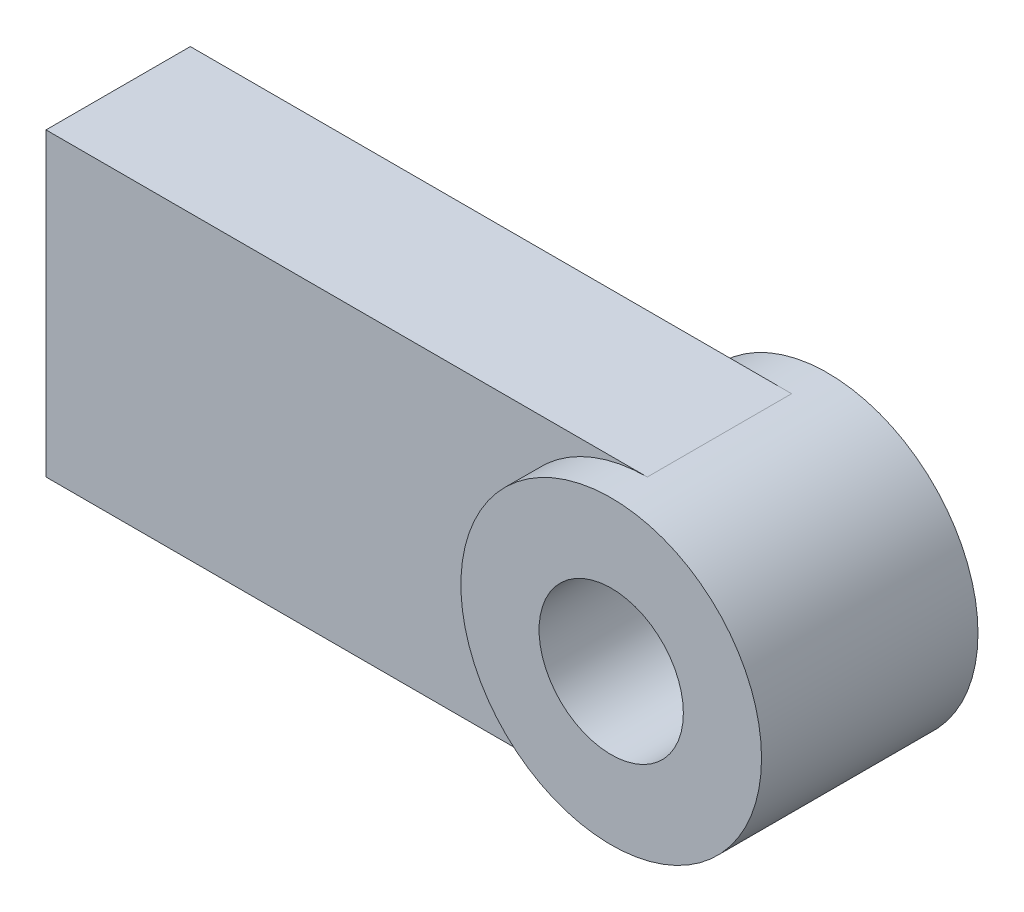
ISO-10303-21;
HEADER;
FILE_DESCRIPTION(('STEP AP214'),'2;1');
FILE_NAME('part.step','',(''),(''),'','','');
FILE_SCHEMA(('AUTOMOTIVE_DESIGN { 1 0 10303 214 1 1 1 1 }'));
ENDSEC;
DATA;
#1=APPLICATION_CONTEXT('core data for automotive mechanical design processes');
#2=APPLICATION_PROTOCOL_DEFINITION('international standard','automotive_design',2000,#1);
#3=PRODUCT_CONTEXT('',#1,'mechanical');
#4=PRODUCT('Part','Part','',(#3));
#5=PRODUCT_RELATED_PRODUCT_CATEGORY('part','',(#4));
#6=PRODUCT_DEFINITION_FORMATION('','',#4);
#7=PRODUCT_DEFINITION_CONTEXT('part definition',#1,'design');
#8=PRODUCT_DEFINITION('design','',#6,#7);
#9=PRODUCT_DEFINITION_SHAPE('','',#8);
#10=(LENGTH_UNIT() NAMED_UNIT(*) SI_UNIT(.MILLI.,.METRE.));
#11=(NAMED_UNIT(*) PLANE_ANGLE_UNIT() SI_UNIT($,.RADIAN.));
#12=(NAMED_UNIT(*) SI_UNIT($,.STERADIAN.) SOLID_ANGLE_UNIT());
#13=UNCERTAINTY_MEASURE_WITH_UNIT(LENGTH_MEASURE(1.E-05),#10,'distance_accuracy_value','');
#14=(GEOMETRIC_REPRESENTATION_CONTEXT(3) GLOBAL_UNCERTAINTY_ASSIGNED_CONTEXT((#13)) GLOBAL_UNIT_ASSIGNED_CONTEXT((#10,
#11,#12)) REPRESENTATION_CONTEXT('',''));
#15=CARTESIAN_POINT('',(0.,0.,0.));
#16=DIRECTION('',(0.,0.,1.));
#17=DIRECTION('',(1.,0.,0.));
#18=AXIS2_PLACEMENT_3D('',#15,#16,#17);
#19=CARTESIAN_POINT('',(0.,25000.,-12000.));
#20=DIRECTION('',(-1.,0.,0.));
#21=DIRECTION('',(0.,0.,1.));
#22=AXIS2_PLACEMENT_3D('',#19,#20,#21);
#23=PLANE('',#22);
#24=DIRECTION('',(0.,-1.,0.));
#25=VECTOR('',#24,1.);
#26=CARTESIAN_POINT('',(0.,25000.,0.));
#27=LINE('',#26,#25);
#28=CARTESIAN_POINT('',(0.,25000.,0.));
#29=VERTEX_POINT('',#28);
#30=CARTESIAN_POINT('',(0.,0.,0.));
#31=VERTEX_POINT('',#30);
#32=EDGE_CURVE('E108',#29,#31,#27,.T.);
#33=ORIENTED_EDGE('',*,*,#32,.F.);
#34=DIRECTION('',(0.,0.,1.));
#35=VECTOR('',#34,1.);
#36=CARTESIAN_POINT('',(0.,25000.,-12000.));
#37=LINE('',#36,#35);
#38=CARTESIAN_POINT('',(0.,25000.,-12000.));
#39=VERTEX_POINT('',#38);
#40=EDGE_CURVE('E11',#39,#29,#37,.T.);
#41=ORIENTED_EDGE('',*,*,#40,.F.);
#42=DIRECTION('',(0.,-1.,0.));
#43=VECTOR('',#42,1.);
#44=CARTESIAN_POINT('',(0.,25000.,-12000.));
#45=LINE('',#44,#43);
#46=CARTESIAN_POINT('',(0.,0.,-12000.));
#47=VERTEX_POINT('',#46);
#48=EDGE_CURVE('E93',#39,#47,#45,.T.);
#49=ORIENTED_EDGE('',*,*,#48,.T.);
#50=DIRECTION('',(0.,0.,1.));
#51=VECTOR('',#50,1.);
#52=CARTESIAN_POINT('',(0.,0.,-12000.));
#53=LINE('',#52,#51);
#54=EDGE_CURVE('E42',#47,#31,#53,.T.);
#55=ORIENTED_EDGE('',*,*,#54,.T.);
#56=EDGE_LOOP('',(#33,#41,#49,#55));
#57=FACE_BOUND('',#56,.T.);
#58=ADVANCED_FACE('F39',(#57),#23,.T.);
#59=CARTESIAN_POINT('',(50000.,25000.,-12000.));
#60=DIRECTION('',(0.,1.,0.));
#61=DIRECTION('',(-1.,0.,0.));
#62=AXIS2_PLACEMENT_3D('',#59,#60,#61);
#63=PLANE('',#62);
#64=DIRECTION('',(-1.,0.,0.));
#65=VECTOR('',#64,1.);
#66=CARTESIAN_POINT('',(50000.,25000.,0.));
#67=LINE('',#66,#65);
#68=CARTESIAN_POINT('',(50000.,25000.,0.));
#69=VERTEX_POINT('',#68);
#70=EDGE_CURVE('E98',#69,#29,#67,.T.);
#71=ORIENTED_EDGE('',*,*,#70,.F.);
#72=DIRECTION('',(0.,0.,1.));
#73=VECTOR('',#72,1.);
#74=CARTESIAN_POINT('',(50000.,25000.,-12000.));
#75=LINE('',#74,#73);
#76=CARTESIAN_POINT('',(50000.,25000.,-12000.));
#77=VERTEX_POINT('',#76);
#78=EDGE_CURVE('E49',#77,#69,#75,.T.);
#79=ORIENTED_EDGE('',*,*,#78,.F.);
#80=DIRECTION('',(-1.,0.,0.));
#81=VECTOR('',#80,1.);
#82=CARTESIAN_POINT('',(50000.,25000.,-12000.));
#83=LINE('',#82,#81);
#84=EDGE_CURVE('E89',#77,#39,#83,.T.);
#85=ORIENTED_EDGE('',*,*,#84,.T.);
#86=ORIENTED_EDGE('',*,*,#40,.T.);
#87=EDGE_LOOP('',(#71,#79,#85,#86));
#88=FACE_BOUND('',#87,.T.);
#89=ADVANCED_FACE('F155',(#88),#63,.T.);
#90=CARTESIAN_POINT('',(0.,0.,-12000.));
#91=DIRECTION('',(0.,-1.,0.));
#92=DIRECTION('',(0.,0.,-1.));
#93=AXIS2_PLACEMENT_3D('',#90,#91,#92);
#94=PLANE('',#93);
#95=DIRECTION('',(1.,0.,0.));
#96=VECTOR('',#95,1.);
#97=CARTESIAN_POINT('',(0.,0.,0.));
#98=LINE('',#97,#96);
#99=CARTESIAN_POINT('',(50000.,-1.77635683940025E-12,0.));
#100=VERTEX_POINT('',#99);
#101=EDGE_CURVE('E85',#31,#100,#98,.T.);
#102=ORIENTED_EDGE('',*,*,#101,.F.);
#103=ORIENTED_EDGE('',*,*,#54,.F.);
#104=DIRECTION('',(1.,0.,0.));
#105=VECTOR('',#104,1.);
#106=CARTESIAN_POINT('',(0.,0.,-12000.));
#107=LINE('',#106,#105);
#108=CARTESIAN_POINT('',(50000.,0.,-12000.));
#109=VERTEX_POINT('',#108);
#110=EDGE_CURVE('E83',#47,#109,#107,.T.);
#111=ORIENTED_EDGE('',*,*,#110,.T.);
#112=DIRECTION('',(0.,0.,1.));
#113=VECTOR('',#112,1.);
#114=CARTESIAN_POINT('',(50000.,0.,-12000.));
#115=LINE('',#114,#113);
#116=EDGE_CURVE('E88',#109,#100,#115,.T.);
#117=ORIENTED_EDGE('',*,*,#116,.T.);
#118=EDGE_LOOP('',(#102,#103,#111,#117));
#119=FACE_BOUND('',#118,.T.);
#120=ADVANCED_FACE('F82',(#119),#94,.T.);
#121=CARTESIAN_POINT('',(0.,0.,-12000.));
#122=DIRECTION('',(0.,0.,1.));
#123=DIRECTION('',(1.,0.,0.));
#124=AXIS2_PLACEMENT_3D('',#121,#122,#123);
#125=PLANE('',#124);
#126=ORIENTED_EDGE('',*,*,#84,.F.);
#127=CARTESIAN_POINT('',(50000.,12500.,-12000.));
#128=DIRECTION('',(0.,0.,1.));
#129=DIRECTION('',(1.,0.,0.));
#130=AXIS2_PLACEMENT_3D('',#127,#128,#129);
#131=CIRCLE('',#130,12500.);
#132=EDGE_CURVE('E73',#77,#109,#131,.T.);
#133=ORIENTED_EDGE('',*,*,#132,.T.);
#134=ORIENTED_EDGE('',*,*,#110,.F.);
#135=ORIENTED_EDGE('',*,*,#48,.F.);
#136=EDGE_LOOP('',(#126,#133,#134,#135));
#137=FACE_BOUND('',#136,.T.);
#138=ADVANCED_FACE('F92',(#137),#125,.F.);
#139=CARTESIAN_POINT('',(0.,0.,0.));
#140=DIRECTION('',(0.,0.,1.));
#141=DIRECTION('',(1.,0.,0.));
#142=AXIS2_PLACEMENT_3D('',#139,#140,#141);
#143=PLANE('',#142);
#144=CARTESIAN_POINT('',(50000.,12500.,0.));
#145=DIRECTION('',(0.,0.,1.));
#146=DIRECTION('',(1.,0.,0.));
#147=AXIS2_PLACEMENT_3D('',#144,#145,#146);
#148=CIRCLE('',#147,12500.);
#149=EDGE_CURVE('E119',#69,#100,#148,.T.);
#150=ORIENTED_EDGE('',*,*,#149,.F.);
#151=ORIENTED_EDGE('',*,*,#70,.T.);
#152=ORIENTED_EDGE('',*,*,#32,.T.);
#153=ORIENTED_EDGE('',*,*,#101,.T.);
#154=EDGE_LOOP('',(#150,#151,#152,#153));
#155=FACE_BOUND('',#154,.T.);
#156=ADVANCED_FACE('F118',(#155),#143,.T.);
#157=CARTESIAN_POINT('',(50000.,12500.,-15000.));
#158=DIRECTION('',(0.,0.,1.));
#159=DIRECTION('',(1.,0.,0.));
#160=AXIS2_PLACEMENT_3D('',#157,#158,#159);
#161=CYLINDRICAL_SURFACE('',#160,12500.);
#162=ORIENTED_EDGE('',*,*,#132,.F.);
#163=ORIENTED_EDGE('',*,*,#78,.T.);
#164=ORIENTED_EDGE('',*,*,#149,.T.);
#165=ORIENTED_EDGE('',*,*,#116,.F.);
#166=EDGE_LOOP('',(#162,#163,#164,#165));
#167=FACE_BOUND('',#166,.T.);
#168=CARTESIAN_POINT('',(50000.,12500.,-15000.));
#169=DIRECTION('',(0.,0.,1.));
#170=DIRECTION('',(1.,0.,0.));
#171=AXIS2_PLACEMENT_3D('',#168,#169,#170);
#172=CIRCLE('',#171,12500.);
#173=CARTESIAN_POINT('',(62500.,12500.,-15000.));
#174=VERTEX_POINT('',#173);
#175=EDGE_CURVE('E129',#174,#174,#172,.T.);
#176=ORIENTED_EDGE('',*,*,#175,.T.);
#177=EDGE_LOOP('',(#176));
#178=FACE_BOUND('',#177,.T.);
#179=CARTESIAN_POINT('',(50000.,12500.,3000.));
#180=DIRECTION('',(0.,0.,1.));
#181=DIRECTION('',(1.,0.,0.));
#182=AXIS2_PLACEMENT_3D('',#179,#180,#181);
#183=CIRCLE('',#182,12500.);
#184=CARTESIAN_POINT('',(62500.,12500.,3000.));
#185=VERTEX_POINT('',#184);
#186=EDGE_CURVE('E123',#185,#185,#183,.T.);
#187=ORIENTED_EDGE('',*,*,#186,.F.);
#188=EDGE_LOOP('',(#187));
#189=FACE_BOUND('',#188,.T.);
#190=ADVANCED_FACE('F120',(#167,#178,#189),#161,.T.);
#191=CARTESIAN_POINT('',(50000.,12500.,-15000.));
#192=DIRECTION('',(0.,0.,1.));
#193=DIRECTION('',(1.,0.,0.));
#194=AXIS2_PLACEMENT_3D('',#191,#192,#193);
#195=PLANE('',#194);
#196=CARTESIAN_POINT('',(50000.,12500.,-15000.));
#197=DIRECTION('',(0.,0.,1.));
#198=DIRECTION('',(1.,0.,0.));
#199=AXIS2_PLACEMENT_3D('',#196,#197,#198);
#200=CIRCLE('',#199,6000.);
#201=CARTESIAN_POINT('',(56000.,12500.,-15000.));
#202=VERTEX_POINT('',#201);
#203=EDGE_CURVE('E124',#202,#202,#200,.T.);
#204=ORIENTED_EDGE('',*,*,#203,.T.);
#205=EDGE_LOOP('',(#204));
#206=FACE_BOUND('',#205,.T.);
#207=ORIENTED_EDGE('',*,*,#175,.F.);
#208=EDGE_LOOP('',(#207));
#209=FACE_BOUND('',#208,.T.);
#210=ADVANCED_FACE('F141',(#206,#209),#195,.F.);
#211=CARTESIAN_POINT('',(50000.,12500.,3000.));
#212=DIRECTION('',(0.,0.,1.));
#213=DIRECTION('',(1.,0.,0.));
#214=AXIS2_PLACEMENT_3D('',#211,#212,#213);
#215=PLANE('',#214);
#216=CARTESIAN_POINT('',(50000.,12500.,3000.));
#217=DIRECTION('',(0.,0.,1.));
#218=DIRECTION('',(1.,0.,0.));
#219=AXIS2_PLACEMENT_3D('',#216,#217,#218);
#220=CIRCLE('',#219,6000.);
#221=CARTESIAN_POINT('',(56000.,12500.,3000.));
#222=VERTEX_POINT('',#221);
#223=EDGE_CURVE('E132',#222,#222,#220,.T.);
#224=ORIENTED_EDGE('',*,*,#223,.F.);
#225=EDGE_LOOP('',(#224));
#226=FACE_BOUND('',#225,.T.);
#227=ORIENTED_EDGE('',*,*,#186,.T.);
#228=EDGE_LOOP('',(#227));
#229=FACE_BOUND('',#228,.T.);
#230=ADVANCED_FACE('F143',(#226,#229),#215,.T.);
#231=CARTESIAN_POINT('',(50000.,12500.,-15000.));
#232=DIRECTION('',(0.,0.,1.));
#233=DIRECTION('',(1.,0.,0.));
#234=AXIS2_PLACEMENT_3D('',#231,#232,#233);
#235=CYLINDRICAL_SURFACE('',#234,6000.);
#236=ORIENTED_EDGE('',*,*,#203,.F.);
#237=EDGE_LOOP('',(#236));
#238=FACE_BOUND('',#237,.T.);
#239=ORIENTED_EDGE('',*,*,#223,.T.);
#240=EDGE_LOOP('',(#239));
#241=FACE_BOUND('',#240,.T.);
#242=ADVANCED_FACE('F150',(#238,#241),#235,.F.);
#243=CLOSED_SHELL('',(#58,#89,#120,#138,#156,#190,#210,#230,#242));
#244=MANIFOLD_SOLID_BREP('B2',#243);
#245=ADVANCED_BREP_SHAPE_REPRESENTATION('',(#18,#244),#14);
#246=SHAPE_DEFINITION_REPRESENTATION(#9,#245);
ENDSEC;
END-ISO-10303-21;
